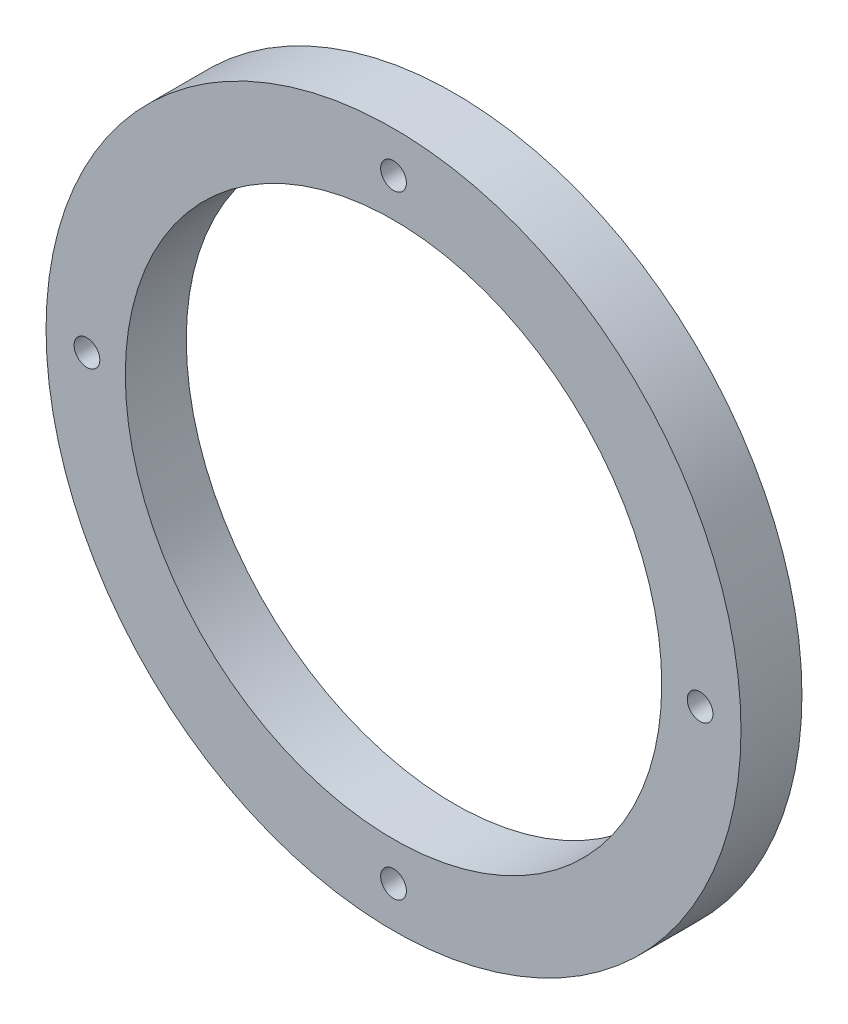
ISO-10303-21;
HEADER;
FILE_DESCRIPTION(('STEP AP214'),'2;1');
FILE_NAME('part.step','',(''),(''),'','','');
FILE_SCHEMA(('AUTOMOTIVE_DESIGN { 1 0 10303 214 1 1 1 1 }'));
ENDSEC;
DATA;
#1=APPLICATION_CONTEXT('core data for automotive mechanical design processes');
#2=APPLICATION_PROTOCOL_DEFINITION('international standard','automotive_design',2000,#1);
#3=PRODUCT_CONTEXT('',#1,'mechanical');
#4=PRODUCT('Part','Part','',(#3));
#5=PRODUCT_RELATED_PRODUCT_CATEGORY('part','',(#4));
#6=PRODUCT_DEFINITION_FORMATION('','',#4);
#7=PRODUCT_DEFINITION_CONTEXT('part definition',#1,'design');
#8=PRODUCT_DEFINITION('design','',#6,#7);
#9=PRODUCT_DEFINITION_SHAPE('','',#8);
#10=(LENGTH_UNIT() NAMED_UNIT(*) SI_UNIT(.MILLI.,.METRE.));
#11=(NAMED_UNIT(*) PLANE_ANGLE_UNIT() SI_UNIT($,.RADIAN.));
#12=(NAMED_UNIT(*) SI_UNIT($,.STERADIAN.) SOLID_ANGLE_UNIT());
#13=UNCERTAINTY_MEASURE_WITH_UNIT(LENGTH_MEASURE(1.E-05),#10,'distance_accuracy_value','');
#14=(GEOMETRIC_REPRESENTATION_CONTEXT(3) GLOBAL_UNCERTAINTY_ASSIGNED_CONTEXT((#13)) GLOBAL_UNIT_ASSIGNED_CONTEXT((#10,
#11,#12)) REPRESENTATION_CONTEXT('',''));
#15=CARTESIAN_POINT('',(0.,0.,0.));
#16=DIRECTION('',(0.,0.,1.));
#17=DIRECTION('',(1.,0.,0.));
#18=AXIS2_PLACEMENT_3D('',#15,#16,#17);
#19=CARTESIAN_POINT('',(0.,0.,10.));
#20=DIRECTION('',(0.,0.,-1.));
#21=DIRECTION('',(-1.,0.,0.));
#22=AXIS2_PLACEMENT_3D('',#19,#20,#21);
#23=CYLINDRICAL_SURFACE('',#22,57.);
#24=CARTESIAN_POINT('',(0.,0.,10.));
#25=DIRECTION('',(0.,0.,1.));
#26=DIRECTION('',(1.,0.,0.));
#27=AXIS2_PLACEMENT_3D('',#24,#25,#26);
#28=CIRCLE('',#27,57.);
#29=CARTESIAN_POINT('',(57.,0.,10.));
#30=VERTEX_POINT('',#29);
#31=EDGE_CURVE('E10',#30,#30,#28,.T.);
#32=ORIENTED_EDGE('',*,*,#31,.F.);
#33=EDGE_LOOP('',(#32));
#34=FACE_BOUND('',#33,.T.);
#35=CARTESIAN_POINT('',(0.,0.,0.));
#36=DIRECTION('',(0.,0.,1.));
#37=DIRECTION('',(1.,0.,0.));
#38=AXIS2_PLACEMENT_3D('',#35,#36,#37);
#39=CIRCLE('',#38,57.);
#40=CARTESIAN_POINT('',(57.,0.,0.));
#41=VERTEX_POINT('',#40);
#42=EDGE_CURVE('E44',#41,#41,#39,.T.);
#43=ORIENTED_EDGE('',*,*,#42,.T.);
#44=EDGE_LOOP('',(#43));
#45=FACE_BOUND('',#44,.T.);
#46=ADVANCED_FACE('F41',(#34,#45),#23,.T.);
#47=CARTESIAN_POINT('',(0.,0.,10.));
#48=DIRECTION('',(0.,0.,1.));
#49=DIRECTION('',(1.,0.,0.));
#50=AXIS2_PLACEMENT_3D('',#47,#48,#49);
#51=PLANE('',#50);
#52=CARTESIAN_POINT('',(-50.2900615080657,0.,10.));
#53=DIRECTION('',(0.,0.,1.));
#54=DIRECTION('',(1.,0.,0.));
#55=AXIS2_PLACEMENT_3D('',#52,#53,#54);
#56=CIRCLE('',#55,2.11054582144867);
#57=CARTESIAN_POINT('',(-48.179515686617,0.,10.));
#58=VERTEX_POINT('',#57);
#59=EDGE_CURVE('E77',#58,#58,#56,.T.);
#60=ORIENTED_EDGE('',*,*,#59,.F.);
#61=EDGE_LOOP('',(#60));
#62=FACE_BOUND('',#61,.T.);
#63=CARTESIAN_POINT('',(0.,50.2900615080657,10.));
#64=DIRECTION('',(0.,0.,1.));
#65=DIRECTION('',(1.,0.,0.));
#66=AXIS2_PLACEMENT_3D('',#63,#64,#65);
#67=CIRCLE('',#66,2.11054582144866);
#68=CARTESIAN_POINT('',(2.11054582144866,50.2900615080657,10.));
#69=VERTEX_POINT('',#68);
#70=EDGE_CURVE('E74',#69,#69,#67,.T.);
#71=ORIENTED_EDGE('',*,*,#70,.F.);
#72=EDGE_LOOP('',(#71));
#73=FACE_BOUND('',#72,.T.);
#74=CARTESIAN_POINT('',(50.2900615080657,0.,10.));
#75=DIRECTION('',(0.,0.,1.));
#76=DIRECTION('',(1.,0.,0.));
#77=AXIS2_PLACEMENT_3D('',#74,#75,#76);
#78=CIRCLE('',#77,2.11054582144867);
#79=CARTESIAN_POINT('',(52.4006073295144,0.,10.));
#80=VERTEX_POINT('',#79);
#81=EDGE_CURVE('E68',#80,#80,#78,.T.);
#82=ORIENTED_EDGE('',*,*,#81,.F.);
#83=EDGE_LOOP('',(#82));
#84=FACE_BOUND('',#83,.T.);
#85=CARTESIAN_POINT('',(0.,-50.2900615080657,10.));
#86=DIRECTION('',(0.,0.,1.));
#87=DIRECTION('',(1.,0.,0.));
#88=AXIS2_PLACEMENT_3D('',#85,#86,#87);
#89=CIRCLE('',#88,2.11054582144866);
#90=CARTESIAN_POINT('',(2.11054582144867,-50.2900615080657,10.));
#91=VERTEX_POINT('',#90);
#92=EDGE_CURVE('E62',#91,#91,#89,.T.);
#93=ORIENTED_EDGE('',*,*,#92,.F.);
#94=EDGE_LOOP('',(#93));
#95=FACE_BOUND('',#94,.T.);
#96=CARTESIAN_POINT('',(0.,0.,10.));
#97=DIRECTION('',(0.,0.,1.));
#98=DIRECTION('',(1.,0.,0.));
#99=AXIS2_PLACEMENT_3D('',#96,#97,#98);
#100=CIRCLE('',#99,44.);
#101=CARTESIAN_POINT('',(44.,0.,10.));
#102=VERTEX_POINT('',#101);
#103=EDGE_CURVE('E53',#102,#102,#100,.T.);
#104=ORIENTED_EDGE('',*,*,#103,.F.);
#105=EDGE_LOOP('',(#104));
#106=FACE_BOUND('',#105,.T.);
#107=ORIENTED_EDGE('',*,*,#31,.T.);
#108=EDGE_LOOP('',(#107));
#109=FACE_BOUND('',#108,.T.);
#110=ADVANCED_FACE('F93',(#62,#73,#84,#95,#106,#109),#51,.T.);
#111=CARTESIAN_POINT('',(0.,0.,0.));
#112=DIRECTION('',(0.,0.,1.));
#113=DIRECTION('',(1.,0.,0.));
#114=AXIS2_PLACEMENT_3D('',#111,#112,#113);
#115=PLANE('',#114);
#116=CARTESIAN_POINT('',(-50.2900615080657,0.,0.));
#117=DIRECTION('',(0.,0.,1.));
#118=DIRECTION('',(1.,0.,0.));
#119=AXIS2_PLACEMENT_3D('',#116,#117,#118);
#120=CIRCLE('',#119,2.11054582144867);
#121=CARTESIAN_POINT('',(-48.179515686617,0.,0.));
#122=VERTEX_POINT('',#121);
#123=EDGE_CURVE('E56',#122,#122,#120,.T.);
#124=ORIENTED_EDGE('',*,*,#123,.T.);
#125=EDGE_LOOP('',(#124));
#126=FACE_BOUND('',#125,.T.);
#127=CARTESIAN_POINT('',(0.,50.2900615080657,0.));
#128=DIRECTION('',(0.,0.,1.));
#129=DIRECTION('',(1.,0.,0.));
#130=AXIS2_PLACEMENT_3D('',#127,#128,#129);
#131=CIRCLE('',#130,2.11054582144866);
#132=CARTESIAN_POINT('',(2.11054582144866,50.2900615080657,0.));
#133=VERTEX_POINT('',#132);
#134=EDGE_CURVE('E71',#133,#133,#131,.T.);
#135=ORIENTED_EDGE('',*,*,#134,.T.);
#136=EDGE_LOOP('',(#135));
#137=FACE_BOUND('',#136,.T.);
#138=CARTESIAN_POINT('',(50.2900615080657,0.,0.));
#139=DIRECTION('',(0.,0.,1.));
#140=DIRECTION('',(1.,0.,0.));
#141=AXIS2_PLACEMENT_3D('',#138,#139,#140);
#142=CIRCLE('',#141,2.11054582144867);
#143=CARTESIAN_POINT('',(52.4006073295144,0.,0.));
#144=VERTEX_POINT('',#143);
#145=EDGE_CURVE('E65',#144,#144,#142,.T.);
#146=ORIENTED_EDGE('',*,*,#145,.T.);
#147=EDGE_LOOP('',(#146));
#148=FACE_BOUND('',#147,.T.);
#149=CARTESIAN_POINT('',(0.,-50.2900615080657,0.));
#150=DIRECTION('',(0.,0.,1.));
#151=DIRECTION('',(1.,0.,0.));
#152=AXIS2_PLACEMENT_3D('',#149,#150,#151);
#153=CIRCLE('',#152,2.11054582144866);
#154=CARTESIAN_POINT('',(2.11054582144867,-50.2900615080657,0.));
#155=VERTEX_POINT('',#154);
#156=EDGE_CURVE('E59',#155,#155,#153,.T.);
#157=ORIENTED_EDGE('',*,*,#156,.T.);
#158=EDGE_LOOP('',(#157));
#159=FACE_BOUND('',#158,.T.);
#160=CARTESIAN_POINT('',(0.,0.,0.));
#161=DIRECTION('',(0.,0.,1.));
#162=DIRECTION('',(1.,0.,0.));
#163=AXIS2_PLACEMENT_3D('',#160,#161,#162);
#164=CIRCLE('',#163,44.);
#165=CARTESIAN_POINT('',(44.,0.,0.));
#166=VERTEX_POINT('',#165);
#167=EDGE_CURVE('E51',#166,#166,#164,.T.);
#168=ORIENTED_EDGE('',*,*,#167,.T.);
#169=EDGE_LOOP('',(#168));
#170=FACE_BOUND('',#169,.T.);
#171=ORIENTED_EDGE('',*,*,#42,.F.);
#172=EDGE_LOOP('',(#171));
#173=FACE_BOUND('',#172,.T.);
#174=ADVANCED_FACE('F83',(#126,#137,#148,#159,#170,#173),#115,.F.);
#175=CARTESIAN_POINT('',(0.,0.,0.));
#176=DIRECTION('',(0.,0.,1.));
#177=DIRECTION('',(1.,0.,0.));
#178=AXIS2_PLACEMENT_3D('',#175,#176,#177);
#179=CYLINDRICAL_SURFACE('',#178,44.);
#180=ORIENTED_EDGE('',*,*,#167,.F.);
#181=EDGE_LOOP('',(#180));
#182=FACE_BOUND('',#181,.T.);
#183=ORIENTED_EDGE('',*,*,#103,.T.);
#184=EDGE_LOOP('',(#183));
#185=FACE_BOUND('',#184,.T.);
#186=ADVANCED_FACE('F105',(#182,#185),#179,.F.);
#187=CARTESIAN_POINT('',(0.,-50.2900615080657,0.));
#188=DIRECTION('',(0.,0.,1.));
#189=DIRECTION('',(1.,0.,0.));
#190=AXIS2_PLACEMENT_3D('',#187,#188,#189);
#191=CYLINDRICAL_SURFACE('',#190,2.11054582144866);
#192=ORIENTED_EDGE('',*,*,#156,.F.);
#193=EDGE_LOOP('',(#192));
#194=FACE_BOUND('',#193,.T.);
#195=ORIENTED_EDGE('',*,*,#92,.T.);
#196=EDGE_LOOP('',(#195));
#197=FACE_BOUND('',#196,.T.);
#198=ADVANCED_FACE('F107',(#194,#197),#191,.F.);
#199=CARTESIAN_POINT('',(50.2900615080657,0.,0.));
#200=DIRECTION('',(0.,0.,1.));
#201=DIRECTION('',(1.,0.,0.));
#202=AXIS2_PLACEMENT_3D('',#199,#200,#201);
#203=CYLINDRICAL_SURFACE('',#202,2.11054582144867);
#204=ORIENTED_EDGE('',*,*,#145,.F.);
#205=EDGE_LOOP('',(#204));
#206=FACE_BOUND('',#205,.T.);
#207=ORIENTED_EDGE('',*,*,#81,.T.);
#208=EDGE_LOOP('',(#207));
#209=FACE_BOUND('',#208,.T.);
#210=ADVANCED_FACE('F114',(#206,#209),#203,.F.);
#211=CARTESIAN_POINT('',(0.,50.2900615080657,0.));
#212=DIRECTION('',(0.,0.,1.));
#213=DIRECTION('',(1.,0.,0.));
#214=AXIS2_PLACEMENT_3D('',#211,#212,#213);
#215=CYLINDRICAL_SURFACE('',#214,2.11054582144866);
#216=ORIENTED_EDGE('',*,*,#134,.F.);
#217=EDGE_LOOP('',(#216));
#218=FACE_BOUND('',#217,.T.);
#219=ORIENTED_EDGE('',*,*,#70,.T.);
#220=EDGE_LOOP('',(#219));
#221=FACE_BOUND('',#220,.T.);
#222=ADVANCED_FACE('F89',(#218,#221),#215,.F.);
#223=CARTESIAN_POINT('',(-50.2900615080657,0.,0.));
#224=DIRECTION('',(0.,0.,1.));
#225=DIRECTION('',(1.,0.,0.));
#226=AXIS2_PLACEMENT_3D('',#223,#224,#225);
#227=CYLINDRICAL_SURFACE('',#226,2.11054582144867);
#228=ORIENTED_EDGE('',*,*,#123,.F.);
#229=EDGE_LOOP('',(#228));
#230=FACE_BOUND('',#229,.T.);
#231=ORIENTED_EDGE('',*,*,#59,.T.);
#232=EDGE_LOOP('',(#231));
#233=FACE_BOUND('',#232,.T.);
#234=ADVANCED_FACE('F86',(#230,#233),#227,.F.);
#235=CLOSED_SHELL('',(#46,#110,#174,#186,#198,#210,#222,#234));
#236=MANIFOLD_SOLID_BREP('B2',#235);
#237=ADVANCED_BREP_SHAPE_REPRESENTATION('',(#18,#236),#14);
#238=SHAPE_DEFINITION_REPRESENTATION(#9,#237);
ENDSEC;
END-ISO-10303-21;
